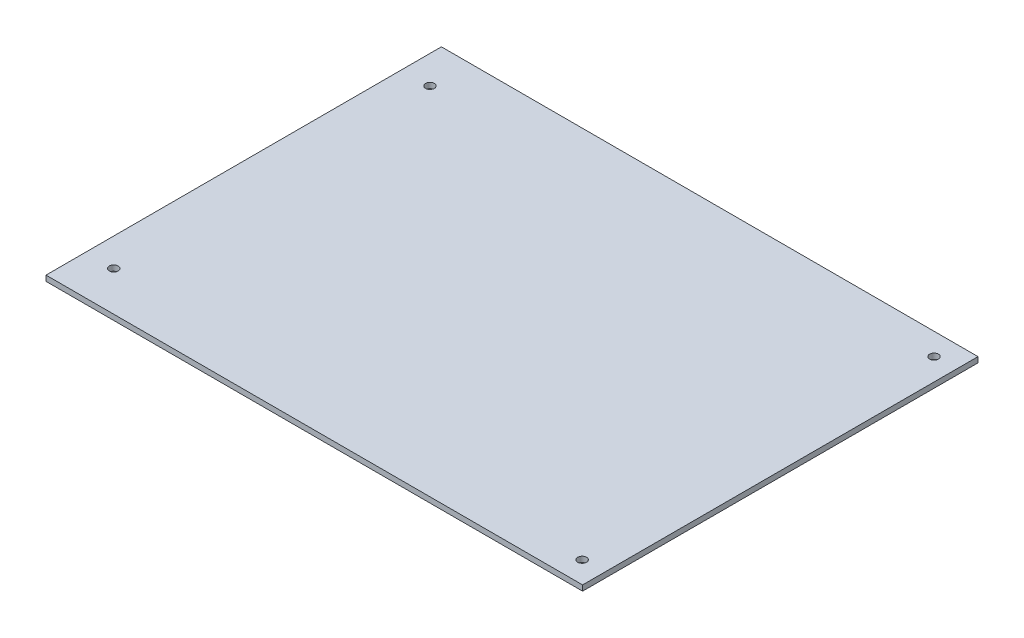
ISO-10303-21;
HEADER;
FILE_DESCRIPTION(('STEP AP214'),'2;1');
FILE_NAME('part.step','',(''),(''),'','','');
FILE_SCHEMA(('AUTOMOTIVE_DESIGN { 1 0 10303 214 1 1 1 1 }'));
ENDSEC;
DATA;
#1=APPLICATION_CONTEXT('core data for automotive mechanical design processes');
#2=APPLICATION_PROTOCOL_DEFINITION('international standard','automotive_design',2000,#1);
#3=PRODUCT_CONTEXT('',#1,'mechanical');
#4=PRODUCT('Part','Part','',(#3));
#5=PRODUCT_RELATED_PRODUCT_CATEGORY('part','',(#4));
#6=PRODUCT_DEFINITION_FORMATION('','',#4);
#7=PRODUCT_DEFINITION_CONTEXT('part definition',#1,'design');
#8=PRODUCT_DEFINITION('design','',#6,#7);
#9=PRODUCT_DEFINITION_SHAPE('','',#8);
#10=(LENGTH_UNIT() NAMED_UNIT(*) SI_UNIT(.MILLI.,.METRE.));
#11=(NAMED_UNIT(*) PLANE_ANGLE_UNIT() SI_UNIT($,.RADIAN.));
#12=(NAMED_UNIT(*) SI_UNIT($,.STERADIAN.) SOLID_ANGLE_UNIT());
#13=UNCERTAINTY_MEASURE_WITH_UNIT(LENGTH_MEASURE(1.E-05),#10,'distance_accuracy_value','');
#14=(GEOMETRIC_REPRESENTATION_CONTEXT(3) GLOBAL_UNCERTAINTY_ASSIGNED_CONTEXT((#13)) GLOBAL_UNIT_ASSIGNED_CONTEXT((#10,
#11,#12)) REPRESENTATION_CONTEXT('',''));
#15=CARTESIAN_POINT('',(0.,0.,0.));
#16=DIRECTION('',(0.,0.,1.));
#17=DIRECTION('',(1.,0.,0.));
#18=AXIS2_PLACEMENT_3D('',#15,#16,#17);
#19=CARTESIAN_POINT('',(0.,1.5748,0.));
#20=DIRECTION('',(0.,1.,0.));
#21=DIRECTION('',(0.,0.,1.));
#22=AXIS2_PLACEMENT_3D('',#19,#20,#21);
#23=PLANE('',#22);
#24=CARTESIAN_POINT('',(-69.342,1.5748,45.6565));
#25=DIRECTION('',(0.,1.,0.));
#26=DIRECTION('',(0.,0.,1.));
#27=AXIS2_PLACEMENT_3D('',#24,#25,#26);
#28=CIRCLE('',#27,1.26999999999999);
#29=CARTESIAN_POINT('',(-69.342,1.5748,46.9265));
#30=VERTEX_POINT('',#29);
#31=EDGE_CURVE('E121',#30,#30,#28,.T.);
#32=ORIENTED_EDGE('',*,*,#31,.F.);
#33=EDGE_LOOP('',(#32));
#34=FACE_BOUND('',#33,.T.);
#35=CARTESIAN_POINT('',(71.12,1.5748,50.8635));
#36=DIRECTION('',(0.,1.,0.));
#37=DIRECTION('',(0.,0.,1.));
#38=AXIS2_PLACEMENT_3D('',#35,#36,#37);
#39=CIRCLE('',#38,1.26999999999999);
#40=CARTESIAN_POINT('',(71.12,1.5748,52.1335));
#41=VERTEX_POINT('',#40);
#42=EDGE_CURVE('E100',#41,#41,#39,.T.);
#43=ORIENTED_EDGE('',*,*,#42,.F.);
#44=EDGE_LOOP('',(#43));
#45=FACE_BOUND('',#44,.T.);
#46=DIRECTION('',(0.,0.,-1.));
#47=VECTOR('',#46,1.);
#48=CARTESIAN_POINT('',(77.47,1.5748,-57.0865));
#49=LINE('',#48,#47);
#50=CARTESIAN_POINT('',(77.47,1.5748,57.0865));
#51=VERTEX_POINT('',#50);
#52=CARTESIAN_POINT('',(77.47,1.5748,-57.0865));
#53=VERTEX_POINT('',#52);
#54=EDGE_CURVE('E85',#51,#53,#49,.T.);
#55=ORIENTED_EDGE('',*,*,#54,.T.);
#56=DIRECTION('',(-1.,0.,0.));
#57=VECTOR('',#56,1.);
#58=CARTESIAN_POINT('',(-77.47,1.5748,-57.0865));
#59=LINE('',#58,#57);
#60=CARTESIAN_POINT('',(-77.47,1.5748,-57.0865));
#61=VERTEX_POINT('',#60);
#62=EDGE_CURVE('E80',#53,#61,#59,.T.);
#63=ORIENTED_EDGE('',*,*,#62,.T.);
#64=DIRECTION('',(0.,0.,1.));
#65=VECTOR('',#64,1.);
#66=CARTESIAN_POINT('',(-77.47,1.5748,-57.0865));
#67=LINE('',#66,#65);
#68=CARTESIAN_POINT('',(-77.47,1.5748,57.0865));
#69=VERTEX_POINT('',#68);
#70=EDGE_CURVE('E83',#61,#69,#67,.T.);
#71=ORIENTED_EDGE('',*,*,#70,.T.);
#72=DIRECTION('',(1.,0.,0.));
#73=VECTOR('',#72,1.);
#74=CARTESIAN_POINT('',(-77.47,1.5748,57.0865));
#75=LINE('',#74,#73);
#76=EDGE_CURVE('E50',#69,#51,#75,.T.);
#77=ORIENTED_EDGE('',*,*,#76,.T.);
#78=EDGE_LOOP('',(#55,#63,#71,#77));
#79=FACE_BOUND('',#78,.T.);
#80=CARTESIAN_POINT('',(71.12,1.5748,-50.7365));
#81=DIRECTION('',(0.,1.,0.));
#82=DIRECTION('',(0.,0.,1.));
#83=AXIS2_PLACEMENT_3D('',#80,#81,#82);
#84=CIRCLE('',#83,1.26999999999999);
#85=CARTESIAN_POINT('',(71.12,1.5748,-49.4665));
#86=VERTEX_POINT('',#85);
#87=EDGE_CURVE('E115',#86,#86,#84,.T.);
#88=ORIENTED_EDGE('',*,*,#87,.F.);
#89=EDGE_LOOP('',(#88));
#90=FACE_BOUND('',#89,.T.);
#91=CARTESIAN_POINT('',(-69.342,1.5748,-45.6565));
#92=DIRECTION('',(0.,1.,0.));
#93=DIRECTION('',(0.,0.,1.));
#94=AXIS2_PLACEMENT_3D('',#91,#92,#93);
#95=CIRCLE('',#94,1.26999999999999);
#96=CARTESIAN_POINT('',(-69.342,1.5748,-44.3865));
#97=VERTEX_POINT('',#96);
#98=EDGE_CURVE('E127',#97,#97,#95,.T.);
#99=ORIENTED_EDGE('',*,*,#98,.F.);
#100=EDGE_LOOP('',(#99));
#101=FACE_BOUND('',#100,.T.);
#102=ADVANCED_FACE('F33',(#34,#45,#79,#90,#101),#23,.T.);
#103=CARTESIAN_POINT('',(0.,0.,0.));
#104=DIRECTION('',(0.,1.,0.));
#105=DIRECTION('',(0.,0.,1.));
#106=AXIS2_PLACEMENT_3D('',#103,#104,#105);
#107=PLANE('',#106);
#108=DIRECTION('',(0.,0.,-1.));
#109=VECTOR('',#108,1.);
#110=CARTESIAN_POINT('',(77.47,0.,-57.0865));
#111=LINE('',#110,#109);
#112=CARTESIAN_POINT('',(77.47,0.,57.0865));
#113=VERTEX_POINT('',#112);
#114=CARTESIAN_POINT('',(77.47,0.,-57.0865));
#115=VERTEX_POINT('',#114);
#116=EDGE_CURVE('E97',#113,#115,#111,.T.);
#117=ORIENTED_EDGE('',*,*,#116,.F.);
#118=DIRECTION('',(1.,0.,0.));
#119=VECTOR('',#118,1.);
#120=CARTESIAN_POINT('',(-77.47,0.,57.0865));
#121=LINE('',#120,#119);
#122=CARTESIAN_POINT('',(-77.47,0.,57.0865));
#123=VERTEX_POINT('',#122);
#124=EDGE_CURVE('E73',#123,#113,#121,.T.);
#125=ORIENTED_EDGE('',*,*,#124,.F.);
#126=DIRECTION('',(0.,0.,1.));
#127=VECTOR('',#126,1.);
#128=CARTESIAN_POINT('',(-77.47,0.,-57.0865));
#129=LINE('',#128,#127);
#130=CARTESIAN_POINT('',(-77.47,0.,-57.0865));
#131=VERTEX_POINT('',#130);
#132=EDGE_CURVE('E67',#131,#123,#129,.T.);
#133=ORIENTED_EDGE('',*,*,#132,.F.);
#134=DIRECTION('',(-1.,0.,0.));
#135=VECTOR('',#134,1.);
#136=CARTESIAN_POINT('',(-77.47,0.,-57.0865));
#137=LINE('',#136,#135);
#138=EDGE_CURVE('E89',#115,#131,#137,.T.);
#139=ORIENTED_EDGE('',*,*,#138,.F.);
#140=EDGE_LOOP('',(#117,#125,#133,#139));
#141=FACE_BOUND('',#140,.T.);
#142=CARTESIAN_POINT('',(71.12,0.,50.8635));
#143=DIRECTION('',(0.,1.,0.));
#144=DIRECTION('',(0.,0.,1.));
#145=AXIS2_PLACEMENT_3D('',#142,#143,#144);
#146=CIRCLE('',#145,1.26999999999999);
#147=CARTESIAN_POINT('',(71.12,0.,52.1335));
#148=VERTEX_POINT('',#147);
#149=EDGE_CURVE('E112',#148,#148,#146,.T.);
#150=ORIENTED_EDGE('',*,*,#149,.T.);
#151=EDGE_LOOP('',(#150));
#152=FACE_BOUND('',#151,.T.);
#153=CARTESIAN_POINT('',(71.12,0.,-50.7365));
#154=DIRECTION('',(0.,1.,0.));
#155=DIRECTION('',(0.,0.,1.));
#156=AXIS2_PLACEMENT_3D('',#153,#154,#155);
#157=CIRCLE('',#156,1.26999999999999);
#158=CARTESIAN_POINT('',(71.12,0.,-49.4665));
#159=VERTEX_POINT('',#158);
#160=EDGE_CURVE('E118',#159,#159,#157,.T.);
#161=ORIENTED_EDGE('',*,*,#160,.T.);
#162=EDGE_LOOP('',(#161));
#163=FACE_BOUND('',#162,.T.);
#164=CARTESIAN_POINT('',(-69.342,0.,45.6565));
#165=DIRECTION('',(0.,1.,0.));
#166=DIRECTION('',(0.,0.,1.));
#167=AXIS2_PLACEMENT_3D('',#164,#165,#166);
#168=CIRCLE('',#167,1.26999999999999);
#169=CARTESIAN_POINT('',(-69.342,0.,46.9265));
#170=VERTEX_POINT('',#169);
#171=EDGE_CURVE('E124',#170,#170,#168,.T.);
#172=ORIENTED_EDGE('',*,*,#171,.T.);
#173=EDGE_LOOP('',(#172));
#174=FACE_BOUND('',#173,.T.);
#175=CARTESIAN_POINT('',(-69.342,0.,-45.6565));
#176=DIRECTION('',(0.,1.,0.));
#177=DIRECTION('',(0.,0.,1.));
#178=AXIS2_PLACEMENT_3D('',#175,#176,#177);
#179=CIRCLE('',#178,1.26999999999999);
#180=CARTESIAN_POINT('',(-69.342,0.,-44.3865));
#181=VERTEX_POINT('',#180);
#182=EDGE_CURVE('E130',#181,#181,#179,.T.);
#183=ORIENTED_EDGE('',*,*,#182,.T.);
#184=EDGE_LOOP('',(#183));
#185=FACE_BOUND('',#184,.T.);
#186=ADVANCED_FACE('F108',(#141,#152,#163,#174,#185),#107,.F.);
#187=CARTESIAN_POINT('',(77.47,1.5748,-57.0865));
#188=DIRECTION('',(-1.,0.,0.));
#189=DIRECTION('',(0.,0.,1.));
#190=AXIS2_PLACEMENT_3D('',#187,#188,#189);
#191=PLANE('',#190);
#192=ORIENTED_EDGE('',*,*,#116,.T.);
#193=DIRECTION('',(0.,-1.,0.));
#194=VECTOR('',#193,1.);
#195=CARTESIAN_POINT('',(77.47,1.5748,-57.0865));
#196=LINE('',#195,#194);
#197=EDGE_CURVE('E11',#53,#115,#196,.T.);
#198=ORIENTED_EDGE('',*,*,#197,.F.);
#199=ORIENTED_EDGE('',*,*,#54,.F.);
#200=DIRECTION('',(0.,-1.,0.));
#201=VECTOR('',#200,1.);
#202=CARTESIAN_POINT('',(77.47,1.5748,57.0865));
#203=LINE('',#202,#201);
#204=EDGE_CURVE('E93',#51,#113,#203,.T.);
#205=ORIENTED_EDGE('',*,*,#204,.T.);
#206=EDGE_LOOP('',(#192,#198,#199,#205));
#207=FACE_BOUND('',#206,.T.);
#208=ADVANCED_FACE('F35',(#207),#191,.F.);
#209=CARTESIAN_POINT('',(-77.47,1.5748,-57.0865));
#210=DIRECTION('',(0.,0.,1.));
#211=DIRECTION('',(1.,0.,0.));
#212=AXIS2_PLACEMENT_3D('',#209,#210,#211);
#213=PLANE('',#212);
#214=ORIENTED_EDGE('',*,*,#138,.T.);
#215=DIRECTION('',(0.,-1.,0.));
#216=VECTOR('',#215,1.);
#217=CARTESIAN_POINT('',(-77.47,1.5748,-57.0865));
#218=LINE('',#217,#216);
#219=EDGE_CURVE('E42',#61,#131,#218,.T.);
#220=ORIENTED_EDGE('',*,*,#219,.F.);
#221=ORIENTED_EDGE('',*,*,#62,.F.);
#222=ORIENTED_EDGE('',*,*,#197,.T.);
#223=EDGE_LOOP('',(#214,#220,#221,#222));
#224=FACE_BOUND('',#223,.T.);
#225=ADVANCED_FACE('F88',(#224),#213,.F.);
#226=CARTESIAN_POINT('',(-77.47,1.5748,-57.0865));
#227=DIRECTION('',(1.,0.,0.));
#228=DIRECTION('',(0.,0.,-1.));
#229=AXIS2_PLACEMENT_3D('',#226,#227,#228);
#230=PLANE('',#229);
#231=ORIENTED_EDGE('',*,*,#132,.T.);
#232=DIRECTION('',(0.,-1.,0.));
#233=VECTOR('',#232,1.);
#234=CARTESIAN_POINT('',(-77.47,1.5748,57.0865));
#235=LINE('',#234,#233);
#236=EDGE_CURVE('E90',#69,#123,#235,.T.);
#237=ORIENTED_EDGE('',*,*,#236,.F.);
#238=ORIENTED_EDGE('',*,*,#70,.F.);
#239=ORIENTED_EDGE('',*,*,#219,.T.);
#240=EDGE_LOOP('',(#231,#237,#238,#239));
#241=FACE_BOUND('',#240,.T.);
#242=ADVANCED_FACE('F91',(#241),#230,.F.);
#243=CARTESIAN_POINT('',(-77.47,1.5748,57.0865));
#244=DIRECTION('',(0.,0.,-1.));
#245=DIRECTION('',(-1.,0.,0.));
#246=AXIS2_PLACEMENT_3D('',#243,#244,#245);
#247=PLANE('',#246);
#248=ORIENTED_EDGE('',*,*,#124,.T.);
#249=ORIENTED_EDGE('',*,*,#204,.F.);
#250=ORIENTED_EDGE('',*,*,#76,.F.);
#251=ORIENTED_EDGE('',*,*,#236,.T.);
#252=EDGE_LOOP('',(#248,#249,#250,#251));
#253=FACE_BOUND('',#252,.T.);
#254=ADVANCED_FACE('F105',(#253),#247,.F.);
#255=CARTESIAN_POINT('',(71.12,1.5748,50.8635));
#256=DIRECTION('',(0.,-1.,0.));
#257=DIRECTION('',(0.,0.,-1.));
#258=AXIS2_PLACEMENT_3D('',#255,#256,#257);
#259=CYLINDRICAL_SURFACE('',#258,1.26999999999999);
#260=ORIENTED_EDGE('',*,*,#42,.T.);
#261=EDGE_LOOP('',(#260));
#262=FACE_BOUND('',#261,.T.);
#263=ORIENTED_EDGE('',*,*,#149,.F.);
#264=EDGE_LOOP('',(#263));
#265=FACE_BOUND('',#264,.T.);
#266=ADVANCED_FACE('F149',(#262,#265),#259,.F.);
#267=CARTESIAN_POINT('',(71.12,1.5748,-50.7365));
#268=DIRECTION('',(0.,-1.,0.));
#269=DIRECTION('',(0.,0.,-1.));
#270=AXIS2_PLACEMENT_3D('',#267,#268,#269);
#271=CYLINDRICAL_SURFACE('',#270,1.26999999999999);
#272=ORIENTED_EDGE('',*,*,#87,.T.);
#273=EDGE_LOOP('',(#272));
#274=FACE_BOUND('',#273,.T.);
#275=ORIENTED_EDGE('',*,*,#160,.F.);
#276=EDGE_LOOP('',(#275));
#277=FACE_BOUND('',#276,.T.);
#278=ADVANCED_FACE('F195',(#274,#277),#271,.F.);
#279=CARTESIAN_POINT('',(-69.342,1.5748,45.6565));
#280=DIRECTION('',(0.,-1.,0.));
#281=DIRECTION('',(0.,0.,-1.));
#282=AXIS2_PLACEMENT_3D('',#279,#280,#281);
#283=CYLINDRICAL_SURFACE('',#282,1.26999999999999);
#284=ORIENTED_EDGE('',*,*,#31,.T.);
#285=EDGE_LOOP('',(#284));
#286=FACE_BOUND('',#285,.T.);
#287=ORIENTED_EDGE('',*,*,#171,.F.);
#288=EDGE_LOOP('',(#287));
#289=FACE_BOUND('',#288,.T.);
#290=ADVANCED_FACE('F203',(#286,#289),#283,.F.);
#291=CARTESIAN_POINT('',(-69.342,1.5748,-45.6565));
#292=DIRECTION('',(0.,-1.,0.));
#293=DIRECTION('',(0.,0.,-1.));
#294=AXIS2_PLACEMENT_3D('',#291,#292,#293);
#295=CYLINDRICAL_SURFACE('',#294,1.26999999999999);
#296=ORIENTED_EDGE('',*,*,#98,.T.);
#297=EDGE_LOOP('',(#296));
#298=FACE_BOUND('',#297,.T.);
#299=ORIENTED_EDGE('',*,*,#182,.F.);
#300=EDGE_LOOP('',(#299));
#301=FACE_BOUND('',#300,.T.);
#302=ADVANCED_FACE('F136',(#298,#301),#295,.F.);
#303=CLOSED_SHELL('',(#102,#186,#208,#225,#242,#254,#266,#278,#290,#302));
#304=MANIFOLD_SOLID_BREP('B2',#303);
#305=ADVANCED_BREP_SHAPE_REPRESENTATION('',(#18,#304),#14);
#306=SHAPE_DEFINITION_REPRESENTATION(#9,#305);
ENDSEC;
END-ISO-10303-21;
